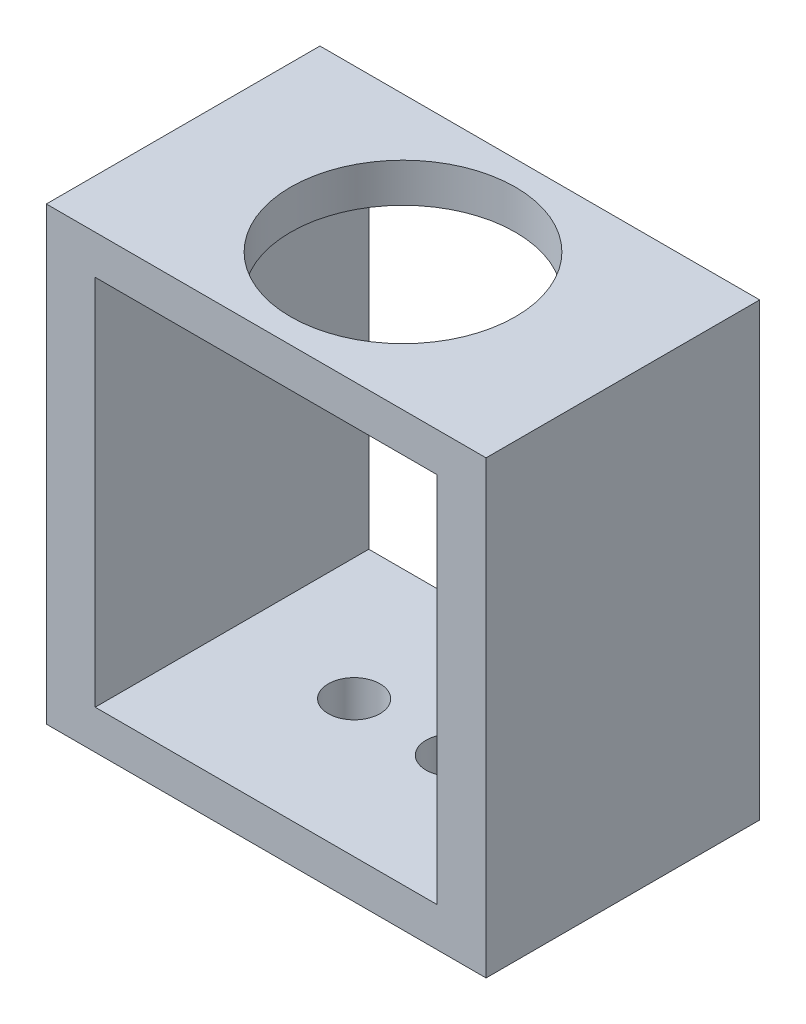
ISO-10303-21;
HEADER;
FILE_DESCRIPTION(('STEP AP214'),'2;1');
FILE_NAME('part.step','',(''),(''),'','','');
FILE_SCHEMA(('AUTOMOTIVE_DESIGN { 1 0 10303 214 1 1 1 1 }'));
ENDSEC;
DATA;
#1=APPLICATION_CONTEXT('core data for automotive mechanical design processes');
#2=APPLICATION_PROTOCOL_DEFINITION('international standard','automotive_design',2000,#1);
#3=PRODUCT_CONTEXT('',#1,'mechanical');
#4=PRODUCT('Part','Part','',(#3));
#5=PRODUCT_RELATED_PRODUCT_CATEGORY('part','',(#4));
#6=PRODUCT_DEFINITION_FORMATION('','',#4);
#7=PRODUCT_DEFINITION_CONTEXT('part definition',#1,'design');
#8=PRODUCT_DEFINITION('design','',#6,#7);
#9=PRODUCT_DEFINITION_SHAPE('','',#8);
#10=(LENGTH_UNIT() NAMED_UNIT(*) SI_UNIT(.MILLI.,.METRE.));
#11=(NAMED_UNIT(*) PLANE_ANGLE_UNIT() SI_UNIT($,.RADIAN.));
#12=(NAMED_UNIT(*) SI_UNIT($,.STERADIAN.) SOLID_ANGLE_UNIT());
#13=UNCERTAINTY_MEASURE_WITH_UNIT(LENGTH_MEASURE(1.E-05),#10,'distance_accuracy_value','');
#14=(GEOMETRIC_REPRESENTATION_CONTEXT(3) GLOBAL_UNCERTAINTY_ASSIGNED_CONTEXT((#13)) GLOBAL_UNIT_ASSIGNED_CONTEXT((#10,
#11,#12)) REPRESENTATION_CONTEXT('',''));
#15=CARTESIAN_POINT('',(0.,0.,0.));
#16=DIRECTION('',(0.,0.,1.));
#17=DIRECTION('',(1.,0.,0.));
#18=AXIS2_PLACEMENT_3D('',#15,#16,#17);
#19=CARTESIAN_POINT('',(0.,4.,0.));
#20=DIRECTION('',(0.,-1.,0.));
#21=DIRECTION('',(0.,0.,-1.));
#22=AXIS2_PLACEMENT_3D('',#19,#20,#21);
#23=PLANE('',#22);
#24=DIRECTION('',(0.,0.,1.));
#25=VECTOR('',#24,1.);
#26=CARTESIAN_POINT('',(0.,4.,0.));
#27=LINE('',#26,#25);
#28=CARTESIAN_POINT('',(0.,4.,-28.));
#29=VERTEX_POINT('',#28);
#30=CARTESIAN_POINT('',(0.,4.,0.));
#31=VERTEX_POINT('',#30);
#32=EDGE_CURVE('E205',#29,#31,#27,.T.);
#33=ORIENTED_EDGE('',*,*,#32,.T.);
#34=DIRECTION('',(1.,0.,0.));
#35=VECTOR('',#34,1.);
#36=CARTESIAN_POINT('',(0.,4.,0.));
#37=LINE('',#36,#35);
#38=CARTESIAN_POINT('',(35.,4.,0.));
#39=VERTEX_POINT('',#38);
#40=EDGE_CURVE('E209',#31,#39,#37,.T.);
#41=ORIENTED_EDGE('',*,*,#40,.T.);
#42=DIRECTION('',(0.,0.,-1.));
#43=VECTOR('',#42,1.);
#44=CARTESIAN_POINT('',(35.,4.,0.));
#45=LINE('',#44,#43);
#46=CARTESIAN_POINT('',(35.,4.,-28.));
#47=VERTEX_POINT('',#46);
#48=EDGE_CURVE('E49',#39,#47,#45,.T.);
#49=ORIENTED_EDGE('',*,*,#48,.T.);
#50=DIRECTION('',(-1.,0.,0.));
#51=VECTOR('',#50,1.);
#52=CARTESIAN_POINT('',(0.,4.,-28.));
#53=LINE('',#52,#51);
#54=EDGE_CURVE('E11',#47,#29,#53,.T.);
#55=ORIENTED_EDGE('',*,*,#54,.T.);
#56=EDGE_LOOP('',(#33,#41,#49,#55));
#57=FACE_BOUND('',#56,.T.);
#58=CARTESIAN_POINT('',(12.5,4.,-14.));
#59=DIRECTION('',(0.,1.,0.));
#60=DIRECTION('',(0.,0.,1.));
#61=AXIS2_PLACEMENT_3D('',#58,#59,#60);
#62=CIRCLE('',#61,2.65);
#63=CARTESIAN_POINT('',(12.5,4.,-11.35));
#64=VERTEX_POINT('',#63);
#65=EDGE_CURVE('E197',#64,#64,#62,.T.);
#66=ORIENTED_EDGE('',*,*,#65,.F.);
#67=EDGE_LOOP('',(#66));
#68=FACE_BOUND('',#67,.T.);
#69=CARTESIAN_POINT('',(22.5,4.,-14.));
#70=DIRECTION('',(0.,1.,0.));
#71=DIRECTION('',(0.,0.,1.));
#72=AXIS2_PLACEMENT_3D('',#69,#70,#71);
#73=CIRCLE('',#72,2.65);
#74=CARTESIAN_POINT('',(22.5,4.,-11.35));
#75=VERTEX_POINT('',#74);
#76=EDGE_CURVE('E189',#75,#75,#73,.T.);
#77=ORIENTED_EDGE('',*,*,#76,.F.);
#78=EDGE_LOOP('',(#77));
#79=FACE_BOUND('',#78,.T.);
#80=ADVANCED_FACE('F39',(#57,#68,#79),#23,.F.);
#81=CARTESIAN_POINT('',(0.,0.,0.));
#82=DIRECTION('',(0.,-1.,0.));
#83=DIRECTION('',(0.,0.,-1.));
#84=AXIS2_PLACEMENT_3D('',#81,#82,#83);
#85=PLANE('',#84);
#86=CARTESIAN_POINT('',(12.5,0.,-14.));
#87=DIRECTION('',(0.,1.,0.));
#88=DIRECTION('',(0.,0.,1.));
#89=AXIS2_PLACEMENT_3D('',#86,#87,#88);
#90=CIRCLE('',#89,2.65);
#91=CARTESIAN_POINT('',(12.5,0.,-11.35));
#92=VERTEX_POINT('',#91);
#93=EDGE_CURVE('E193',#92,#92,#90,.T.);
#94=ORIENTED_EDGE('',*,*,#93,.T.);
#95=EDGE_LOOP('',(#94));
#96=FACE_BOUND('',#95,.T.);
#97=DIRECTION('',(1.,0.,0.));
#98=VECTOR('',#97,1.);
#99=CARTESIAN_POINT('',(0.,0.,0.));
#100=LINE('',#99,#98);
#101=CARTESIAN_POINT('',(-5.,0.,0.));
#102=VERTEX_POINT('',#101);
#103=CARTESIAN_POINT('',(40.,0.,0.));
#104=VERTEX_POINT('',#103);
#105=EDGE_CURVE('E201',#102,#104,#100,.T.);
#106=ORIENTED_EDGE('',*,*,#105,.F.);
#107=DIRECTION('',(0.,0.,-1.));
#108=VECTOR('',#107,1.);
#109=CARTESIAN_POINT('',(-5.,0.,0.));
#110=LINE('',#109,#108);
#111=CARTESIAN_POINT('',(-5.,0.,-28.));
#112=VERTEX_POINT('',#111);
#113=EDGE_CURVE('E117',#102,#112,#110,.T.);
#114=ORIENTED_EDGE('',*,*,#113,.T.);
#115=DIRECTION('',(-1.,0.,0.));
#116=VECTOR('',#115,1.);
#117=CARTESIAN_POINT('',(0.,0.,-28.));
#118=LINE('',#117,#116);
#119=CARTESIAN_POINT('',(40.,0.,-28.));
#120=VERTEX_POINT('',#119);
#121=EDGE_CURVE('E43',#120,#112,#118,.T.);
#122=ORIENTED_EDGE('',*,*,#121,.F.);
#123=DIRECTION('',(0.,0.,1.));
#124=VECTOR('',#123,1.);
#125=CARTESIAN_POINT('',(40.,0.,0.));
#126=LINE('',#125,#124);
#127=EDGE_CURVE('E152',#120,#104,#126,.T.);
#128=ORIENTED_EDGE('',*,*,#127,.T.);
#129=EDGE_LOOP('',(#106,#114,#122,#128));
#130=FACE_BOUND('',#129,.T.);
#131=CARTESIAN_POINT('',(22.5,0.,-14.));
#132=DIRECTION('',(0.,1.,0.));
#133=DIRECTION('',(0.,0.,1.));
#134=AXIS2_PLACEMENT_3D('',#131,#132,#133);
#135=CIRCLE('',#134,2.65);
#136=CARTESIAN_POINT('',(22.5,0.,-11.35));
#137=VERTEX_POINT('',#136);
#138=EDGE_CURVE('E184',#137,#137,#135,.T.);
#139=ORIENTED_EDGE('',*,*,#138,.T.);
#140=EDGE_LOOP('',(#139));
#141=FACE_BOUND('',#140,.T.);
#142=ADVANCED_FACE('F220',(#96,#130,#141),#85,.T.);
#143=CARTESIAN_POINT('',(0.,4.,0.));
#144=DIRECTION('',(0.,0.,-1.));
#145=DIRECTION('',(-1.,0.,0.));
#146=AXIS2_PLACEMENT_3D('',#143,#144,#145);
#147=PLANE('',#146);
#148=DIRECTION('',(1.,0.,0.));
#149=VECTOR('',#148,1.);
#150=CARTESIAN_POINT('',(-5.,46.1,0.));
#151=LINE('',#150,#149);
#152=CARTESIAN_POINT('',(-5.,46.1,0.));
#153=VERTEX_POINT('',#152);
#154=CARTESIAN_POINT('',(40.,46.1,0.));
#155=VERTEX_POINT('',#154);
#156=EDGE_CURVE('E123',#153,#155,#151,.T.);
#157=ORIENTED_EDGE('',*,*,#156,.F.);
#158=DIRECTION('',(0.,-1.,0.));
#159=VECTOR('',#158,1.);
#160=CARTESIAN_POINT('',(-5.,42.1,0.));
#161=LINE('',#160,#159);
#162=EDGE_CURVE('E110',#153,#102,#161,.T.);
#163=ORIENTED_EDGE('',*,*,#162,.T.);
#164=ORIENTED_EDGE('',*,*,#105,.T.);
#165=DIRECTION('',(0.,-1.,0.));
#166=VECTOR('',#165,1.);
#167=CARTESIAN_POINT('',(40.,42.1,0.));
#168=LINE('',#167,#166);
#169=EDGE_CURVE('E126',#155,#104,#168,.T.);
#170=ORIENTED_EDGE('',*,*,#169,.F.);
#171=EDGE_LOOP('',(#157,#163,#164,#170));
#172=FACE_BOUND('',#171,.T.);
#173=DIRECTION('',(0.,-1.,0.));
#174=VECTOR('',#173,1.);
#175=CARTESIAN_POINT('',(0.,42.1,0.));
#176=LINE('',#175,#174);
#177=CARTESIAN_POINT('',(0.,42.1,0.));
#178=VERTEX_POINT('',#177);
#179=EDGE_CURVE('E65',#178,#31,#176,.T.);
#180=ORIENTED_EDGE('',*,*,#179,.F.);
#181=DIRECTION('',(1.,0.,0.));
#182=VECTOR('',#181,1.);
#183=CARTESIAN_POINT('',(-5.,42.1,0.));
#184=LINE('',#183,#182);
#185=CARTESIAN_POINT('',(35.,42.1,0.));
#186=VERTEX_POINT('',#185);
#187=EDGE_CURVE('E142',#178,#186,#184,.T.);
#188=ORIENTED_EDGE('',*,*,#187,.T.);
#189=DIRECTION('',(0.,-1.,0.));
#190=VECTOR('',#189,1.);
#191=CARTESIAN_POINT('',(35.,42.1,0.));
#192=LINE('',#191,#190);
#193=EDGE_CURVE('E163',#186,#39,#192,.T.);
#194=ORIENTED_EDGE('',*,*,#193,.T.);
#195=ORIENTED_EDGE('',*,*,#40,.F.);
#196=EDGE_LOOP('',(#180,#188,#194,#195));
#197=FACE_BOUND('',#196,.T.);
#198=ADVANCED_FACE('F41',(#172,#197),#147,.F.);
#199=CARTESIAN_POINT('',(0.,4.,-28.));
#200=DIRECTION('',(0.,0.,1.));
#201=DIRECTION('',(1.,0.,0.));
#202=AXIS2_PLACEMENT_3D('',#199,#200,#201);
#203=PLANE('',#202);
#204=DIRECTION('',(-1.,0.,0.));
#205=VECTOR('',#204,1.);
#206=CARTESIAN_POINT('',(-5.,42.1,-28.));
#207=LINE('',#206,#205);
#208=CARTESIAN_POINT('',(35.,42.1,-28.));
#209=VERTEX_POINT('',#208);
#210=CARTESIAN_POINT('',(0.,42.1,-28.));
#211=VERTEX_POINT('',#210);
#212=EDGE_CURVE('E139',#209,#211,#207,.T.);
#213=ORIENTED_EDGE('',*,*,#212,.T.);
#214=DIRECTION('',(0.,-1.,0.));
#215=VECTOR('',#214,1.);
#216=CARTESIAN_POINT('',(0.,42.1,-28.));
#217=LINE('',#216,#215);
#218=EDGE_CURVE('E180',#211,#29,#217,.T.);
#219=ORIENTED_EDGE('',*,*,#218,.T.);
#220=ORIENTED_EDGE('',*,*,#54,.F.);
#221=DIRECTION('',(0.,-1.,0.));
#222=VECTOR('',#221,1.);
#223=CARTESIAN_POINT('',(35.,42.1,-28.));
#224=LINE('',#223,#222);
#225=EDGE_CURVE('E57',#209,#47,#224,.T.);
#226=ORIENTED_EDGE('',*,*,#225,.F.);
#227=EDGE_LOOP('',(#213,#219,#220,#226));
#228=FACE_BOUND('',#227,.T.);
#229=ORIENTED_EDGE('',*,*,#121,.T.);
#230=DIRECTION('',(0.,-1.,0.));
#231=VECTOR('',#230,1.);
#232=CARTESIAN_POINT('',(-5.,42.1,-28.));
#233=LINE('',#232,#231);
#234=CARTESIAN_POINT('',(-5.,46.1,-28.));
#235=VERTEX_POINT('',#234);
#236=EDGE_CURVE('E120',#235,#112,#233,.T.);
#237=ORIENTED_EDGE('',*,*,#236,.F.);
#238=DIRECTION('',(-1.,0.,0.));
#239=VECTOR('',#238,1.);
#240=CARTESIAN_POINT('',(-5.,46.1,-28.));
#241=LINE('',#240,#239);
#242=CARTESIAN_POINT('',(40.,46.1,-28.));
#243=VERTEX_POINT('',#242);
#244=EDGE_CURVE('E137',#243,#235,#241,.T.);
#245=ORIENTED_EDGE('',*,*,#244,.F.);
#246=DIRECTION('',(0.,-1.,0.));
#247=VECTOR('',#246,1.);
#248=CARTESIAN_POINT('',(40.,42.1,-28.));
#249=LINE('',#248,#247);
#250=EDGE_CURVE('E169',#243,#120,#249,.T.);
#251=ORIENTED_EDGE('',*,*,#250,.T.);
#252=EDGE_LOOP('',(#229,#237,#245,#251));
#253=FACE_BOUND('',#252,.T.);
#254=ADVANCED_FACE('F217',(#228,#253),#203,.F.);
#255=CARTESIAN_POINT('',(12.5,4.,-14.));
#256=DIRECTION('',(0.,-1.,0.));
#257=DIRECTION('',(0.,0.,-1.));
#258=AXIS2_PLACEMENT_3D('',#255,#256,#257);
#259=CYLINDRICAL_SURFACE('',#258,2.65);
#260=ORIENTED_EDGE('',*,*,#65,.T.);
#261=EDGE_LOOP('',(#260));
#262=FACE_BOUND('',#261,.T.);
#263=ORIENTED_EDGE('',*,*,#93,.F.);
#264=EDGE_LOOP('',(#263));
#265=FACE_BOUND('',#264,.T.);
#266=ADVANCED_FACE('F245',(#262,#265),#259,.F.);
#267=CARTESIAN_POINT('',(22.5,4.,-14.));
#268=DIRECTION('',(0.,-1.,0.));
#269=DIRECTION('',(0.,0.,-1.));
#270=AXIS2_PLACEMENT_3D('',#267,#268,#269);
#271=CYLINDRICAL_SURFACE('',#270,2.65);
#272=ORIENTED_EDGE('',*,*,#76,.T.);
#273=EDGE_LOOP('',(#272));
#274=FACE_BOUND('',#273,.T.);
#275=ORIENTED_EDGE('',*,*,#138,.F.);
#276=EDGE_LOOP('',(#275));
#277=FACE_BOUND('',#276,.T.);
#278=ADVANCED_FACE('F253',(#274,#277),#271,.F.);
#279=CARTESIAN_POINT('',(0.,42.1,0.));
#280=DIRECTION('',(1.,0.,0.));
#281=DIRECTION('',(0.,0.,-1.));
#282=AXIS2_PLACEMENT_3D('',#279,#280,#281);
#283=PLANE('',#282);
#284=ORIENTED_EDGE('',*,*,#32,.F.);
#285=ORIENTED_EDGE('',*,*,#218,.F.);
#286=DIRECTION('',(0.,0.,1.));
#287=VECTOR('',#286,1.);
#288=CARTESIAN_POINT('',(0.,42.1,0.));
#289=LINE('',#288,#287);
#290=EDGE_CURVE('E175',#211,#178,#289,.T.);
#291=ORIENTED_EDGE('',*,*,#290,.T.);
#292=ORIENTED_EDGE('',*,*,#179,.T.);
#293=EDGE_LOOP('',(#284,#285,#291,#292));
#294=FACE_BOUND('',#293,.T.);
#295=ADVANCED_FACE('F260',(#294),#283,.T.);
#296=CARTESIAN_POINT('',(-5.,42.1,0.));
#297=DIRECTION('',(-1.,0.,0.));
#298=DIRECTION('',(0.,0.,1.));
#299=AXIS2_PLACEMENT_3D('',#296,#297,#298);
#300=PLANE('',#299);
#301=ORIENTED_EDGE('',*,*,#113,.F.);
#302=ORIENTED_EDGE('',*,*,#162,.F.);
#303=DIRECTION('',(0.,0.,1.));
#304=VECTOR('',#303,1.);
#305=CARTESIAN_POINT('',(-5.,46.1,-28.));
#306=LINE('',#305,#304);
#307=EDGE_CURVE('E115',#235,#153,#306,.T.);
#308=ORIENTED_EDGE('',*,*,#307,.F.);
#309=ORIENTED_EDGE('',*,*,#236,.T.);
#310=EDGE_LOOP('',(#301,#302,#308,#309));
#311=FACE_BOUND('',#310,.T.);
#312=ADVANCED_FACE('F112',(#311),#300,.T.);
#313=CARTESIAN_POINT('',(35.,42.1,0.));
#314=DIRECTION('',(-1.,0.,0.));
#315=DIRECTION('',(0.,0.,1.));
#316=AXIS2_PLACEMENT_3D('',#313,#314,#315);
#317=PLANE('',#316);
#318=ORIENTED_EDGE('',*,*,#48,.F.);
#319=ORIENTED_EDGE('',*,*,#193,.F.);
#320=DIRECTION('',(0.,0.,-1.));
#321=VECTOR('',#320,1.);
#322=CARTESIAN_POINT('',(35.,42.1,0.));
#323=LINE('',#322,#321);
#324=EDGE_CURVE('E157',#186,#209,#323,.T.);
#325=ORIENTED_EDGE('',*,*,#324,.T.);
#326=ORIENTED_EDGE('',*,*,#225,.T.);
#327=EDGE_LOOP('',(#318,#319,#325,#326));
#328=FACE_BOUND('',#327,.T.);
#329=ADVANCED_FACE('F225',(#328),#317,.T.);
#330=CARTESIAN_POINT('',(40.,42.1,0.));
#331=DIRECTION('',(1.,0.,0.));
#332=DIRECTION('',(0.,0.,-1.));
#333=AXIS2_PLACEMENT_3D('',#330,#331,#332);
#334=PLANE('',#333);
#335=ORIENTED_EDGE('',*,*,#127,.F.);
#336=ORIENTED_EDGE('',*,*,#250,.F.);
#337=DIRECTION('',(0.,0.,-1.));
#338=VECTOR('',#337,1.);
#339=CARTESIAN_POINT('',(40.,46.1,-28.));
#340=LINE('',#339,#338);
#341=EDGE_CURVE('E131',#155,#243,#340,.T.);
#342=ORIENTED_EDGE('',*,*,#341,.F.);
#343=ORIENTED_EDGE('',*,*,#169,.T.);
#344=EDGE_LOOP('',(#335,#336,#342,#343));
#345=FACE_BOUND('',#344,.T.);
#346=ADVANCED_FACE('F223',(#345),#334,.T.);
#347=CARTESIAN_POINT('',(0.,46.1,0.));
#348=DIRECTION('',(0.,1.,0.));
#349=DIRECTION('',(0.,0.,1.));
#350=AXIS2_PLACEMENT_3D('',#347,#348,#349);
#351=PLANE('',#350);
#352=ORIENTED_EDGE('',*,*,#307,.T.);
#353=ORIENTED_EDGE('',*,*,#156,.T.);
#354=ORIENTED_EDGE('',*,*,#341,.T.);
#355=ORIENTED_EDGE('',*,*,#244,.T.);
#356=EDGE_LOOP('',(#352,#353,#354,#355));
#357=FACE_BOUND('',#356,.T.);
#358=CARTESIAN_POINT('',(17.5,46.1,-14.));
#359=DIRECTION('',(0.,1.,0.));
#360=DIRECTION('',(0.,0.,1.));
#361=AXIS2_PLACEMENT_3D('',#358,#359,#360);
#362=CIRCLE('',#361,11.5);
#363=CARTESIAN_POINT('',(17.5,46.1,-2.5));
#364=VERTEX_POINT('',#363);
#365=EDGE_CURVE('E155',#364,#364,#362,.T.);
#366=ORIENTED_EDGE('',*,*,#365,.F.);
#367=EDGE_LOOP('',(#366));
#368=FACE_BOUND('',#367,.T.);
#369=ADVANCED_FACE('F134',(#357,#368),#351,.T.);
#370=CARTESIAN_POINT('',(0.,42.1,0.));
#371=DIRECTION('',(0.,1.,0.));
#372=DIRECTION('',(0.,0.,1.));
#373=AXIS2_PLACEMENT_3D('',#370,#371,#372);
#374=PLANE('',#373);
#375=ORIENTED_EDGE('',*,*,#290,.F.);
#376=ORIENTED_EDGE('',*,*,#212,.F.);
#377=ORIENTED_EDGE('',*,*,#324,.F.);
#378=ORIENTED_EDGE('',*,*,#187,.F.);
#379=EDGE_LOOP('',(#375,#376,#377,#378));
#380=FACE_BOUND('',#379,.T.);
#381=CARTESIAN_POINT('',(17.5,42.1,-14.));
#382=DIRECTION('',(0.,1.,0.));
#383=DIRECTION('',(0.,0.,1.));
#384=AXIS2_PLACEMENT_3D('',#381,#382,#383);
#385=CIRCLE('',#384,11.5);
#386=CARTESIAN_POINT('',(17.5,42.1,-2.5));
#387=VERTEX_POINT('',#386);
#388=EDGE_CURVE('E145',#387,#387,#385,.T.);
#389=ORIENTED_EDGE('',*,*,#388,.T.);
#390=EDGE_LOOP('',(#389));
#391=FACE_BOUND('',#390,.T.);
#392=ADVANCED_FACE('F231',(#380,#391),#374,.F.);
#393=CARTESIAN_POINT('',(17.5,46.1,-14.));
#394=DIRECTION('',(0.,-1.,0.));
#395=DIRECTION('',(0.,0.,-1.));
#396=AXIS2_PLACEMENT_3D('',#393,#394,#395);
#397=CYLINDRICAL_SURFACE('',#396,11.5);
#398=ORIENTED_EDGE('',*,*,#365,.T.);
#399=EDGE_LOOP('',(#398));
#400=FACE_BOUND('',#399,.T.);
#401=ORIENTED_EDGE('',*,*,#388,.F.);
#402=EDGE_LOOP('',(#401));
#403=FACE_BOUND('',#402,.T.);
#404=ADVANCED_FACE('F357',(#400,#403),#397,.F.);
#405=CLOSED_SHELL('',(#80,#142,#198,#254,#266,#278,#295,#312,#329,#346,#369,#392,#404));
#406=MANIFOLD_SOLID_BREP('B2',#405);
#407=ADVANCED_BREP_SHAPE_REPRESENTATION('',(#18,#406),#14);
#408=SHAPE_DEFINITION_REPRESENTATION(#9,#407);
ENDSEC;
END-ISO-10303-21;
